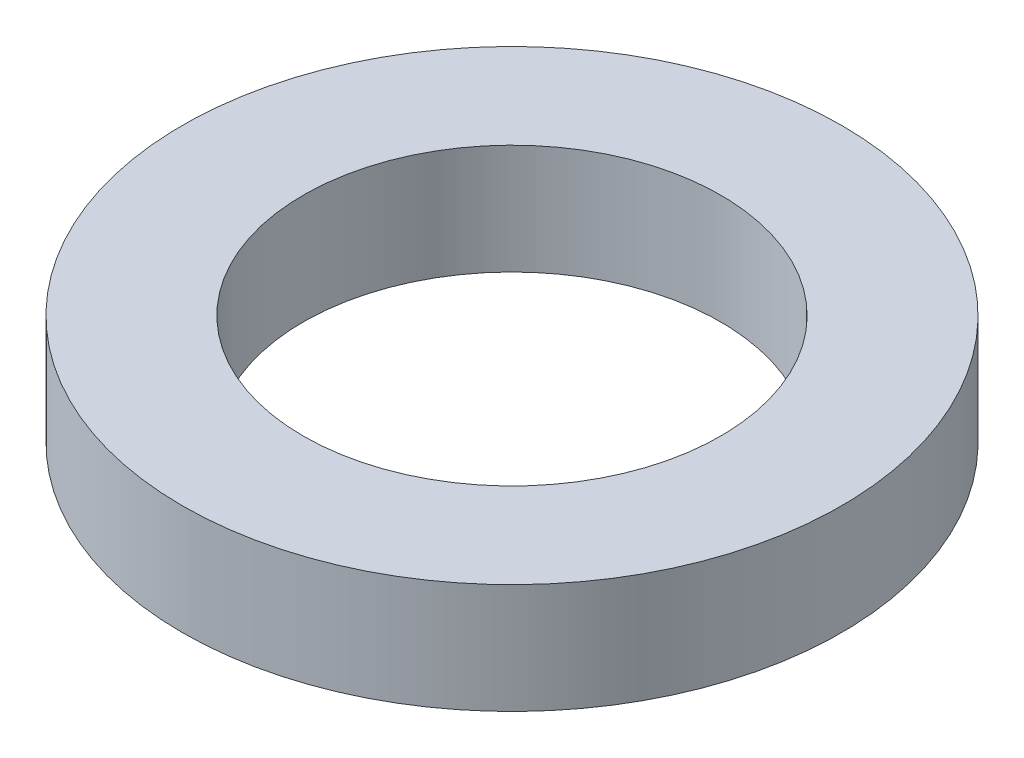
ISO-10303-21;
HEADER;
FILE_DESCRIPTION(('STEP AP214'),'2;1');
FILE_NAME('part.step','',(''),(''),'','','');
FILE_SCHEMA(('AUTOMOTIVE_DESIGN { 1 0 10303 214 1 1 1 1 }'));
ENDSEC;
DATA;
#1=APPLICATION_CONTEXT('core data for automotive mechanical design processes');
#2=APPLICATION_PROTOCOL_DEFINITION('international standard','automotive_design',2000,#1);
#3=PRODUCT_CONTEXT('',#1,'mechanical');
#4=PRODUCT('Part','Part','',(#3));
#5=PRODUCT_RELATED_PRODUCT_CATEGORY('part','',(#4));
#6=PRODUCT_DEFINITION_FORMATION('','',#4);
#7=PRODUCT_DEFINITION_CONTEXT('part definition',#1,'design');
#8=PRODUCT_DEFINITION('design','',#6,#7);
#9=PRODUCT_DEFINITION_SHAPE('','',#8);
#10=(LENGTH_UNIT() NAMED_UNIT(*) SI_UNIT(.MILLI.,.METRE.));
#11=(NAMED_UNIT(*) PLANE_ANGLE_UNIT() SI_UNIT($,.RADIAN.));
#12=(NAMED_UNIT(*) SI_UNIT($,.STERADIAN.) SOLID_ANGLE_UNIT());
#13=UNCERTAINTY_MEASURE_WITH_UNIT(LENGTH_MEASURE(1.E-05),#10,'distance_accuracy_value','');
#14=(GEOMETRIC_REPRESENTATION_CONTEXT(3) GLOBAL_UNCERTAINTY_ASSIGNED_CONTEXT((#13)) GLOBAL_UNIT_ASSIGNED_CONTEXT((#10,
#11,#12)) REPRESENTATION_CONTEXT('',''));
#15=CARTESIAN_POINT('',(0.,0.,0.));
#16=DIRECTION('',(0.,0.,1.));
#17=DIRECTION('',(1.,0.,0.));
#18=AXIS2_PLACEMENT_3D('',#15,#16,#17);
#19=CARTESIAN_POINT('',(0.,1.,0.));
#20=DIRECTION('',(0.,1.,0.));
#21=DIRECTION('',(0.,0.,1.));
#22=AXIS2_PLACEMENT_3D('',#19,#20,#21);
#23=PLANE('',#22);
#24=CARTESIAN_POINT('',(0.,1.,0.));
#25=DIRECTION('',(0.,1.,0.));
#26=DIRECTION('',(0.,0.,1.));
#27=AXIS2_PLACEMENT_3D('',#24,#25,#26);
#28=CIRCLE('',#27,3.);
#29=CARTESIAN_POINT('',(0.,1.,3.));
#30=VERTEX_POINT('',#29);
#31=EDGE_CURVE('E10',#30,#30,#28,.T.);
#32=ORIENTED_EDGE('',*,*,#31,.T.);
#33=EDGE_LOOP('',(#32));
#34=FACE_BOUND('',#33,.T.);
#35=CARTESIAN_POINT('',(0.,1.,0.));
#36=DIRECTION('',(0.,1.,0.));
#37=DIRECTION('',(0.,0.,1.));
#38=AXIS2_PLACEMENT_3D('',#35,#36,#37);
#39=CIRCLE('',#38,1.9);
#40=CARTESIAN_POINT('',(0.,1.,1.9));
#41=VERTEX_POINT('',#40);
#42=EDGE_CURVE('E48',#41,#41,#39,.T.);
#43=ORIENTED_EDGE('',*,*,#42,.F.);
#44=EDGE_LOOP('',(#43));
#45=FACE_BOUND('',#44,.T.);
#46=ADVANCED_FACE('F37',(#34,#45),#23,.T.);
#47=CARTESIAN_POINT('',(0.,0.,0.));
#48=DIRECTION('',(0.,1.,0.));
#49=DIRECTION('',(0.,0.,1.));
#50=AXIS2_PLACEMENT_3D('',#47,#48,#49);
#51=PLANE('',#50);
#52=CARTESIAN_POINT('',(0.,0.,0.));
#53=DIRECTION('',(0.,1.,0.));
#54=DIRECTION('',(0.,0.,1.));
#55=AXIS2_PLACEMENT_3D('',#52,#53,#54);
#56=CIRCLE('',#55,3.);
#57=CARTESIAN_POINT('',(0.,0.,3.));
#58=VERTEX_POINT('',#57);
#59=EDGE_CURVE('E41',#58,#58,#56,.T.);
#60=ORIENTED_EDGE('',*,*,#59,.F.);
#61=EDGE_LOOP('',(#60));
#62=FACE_BOUND('',#61,.T.);
#63=CARTESIAN_POINT('',(0.,0.,0.));
#64=DIRECTION('',(0.,1.,0.));
#65=DIRECTION('',(0.,0.,1.));
#66=AXIS2_PLACEMENT_3D('',#63,#64,#65);
#67=CIRCLE('',#66,1.9);
#68=CARTESIAN_POINT('',(0.,0.,1.9));
#69=VERTEX_POINT('',#68);
#70=EDGE_CURVE('E50',#69,#69,#67,.T.);
#71=ORIENTED_EDGE('',*,*,#70,.T.);
#72=EDGE_LOOP('',(#71));
#73=FACE_BOUND('',#72,.T.);
#74=ADVANCED_FACE('F60',(#62,#73),#51,.F.);
#75=CARTESIAN_POINT('',(0.,1.,0.));
#76=DIRECTION('',(0.,-1.,0.));
#77=DIRECTION('',(0.,0.,-1.));
#78=AXIS2_PLACEMENT_3D('',#75,#76,#77);
#79=CYLINDRICAL_SURFACE('',#78,3.);
#80=ORIENTED_EDGE('',*,*,#31,.F.);
#81=EDGE_LOOP('',(#80));
#82=FACE_BOUND('',#81,.T.);
#83=ORIENTED_EDGE('',*,*,#59,.T.);
#84=EDGE_LOOP('',(#83));
#85=FACE_BOUND('',#84,.T.);
#86=ADVANCED_FACE('F39',(#82,#85),#79,.T.);
#87=CARTESIAN_POINT('',(0.,1.,0.));
#88=DIRECTION('',(0.,-1.,0.));
#89=DIRECTION('',(0.,0.,-1.));
#90=AXIS2_PLACEMENT_3D('',#87,#88,#89);
#91=CYLINDRICAL_SURFACE('',#90,1.9);
#92=ORIENTED_EDGE('',*,*,#42,.T.);
#93=EDGE_LOOP('',(#92));
#94=FACE_BOUND('',#93,.T.);
#95=ORIENTED_EDGE('',*,*,#70,.F.);
#96=EDGE_LOOP('',(#95));
#97=FACE_BOUND('',#96,.T.);
#98=ADVANCED_FACE('F56',(#94,#97),#91,.F.);
#99=CLOSED_SHELL('',(#46,#74,#86,#98));
#100=MANIFOLD_SOLID_BREP('B2',#99);
#101=ADVANCED_BREP_SHAPE_REPRESENTATION('',(#18,#100),#14);
#102=SHAPE_DEFINITION_REPRESENTATION(#9,#101);
ENDSEC;
END-ISO-10303-21;
